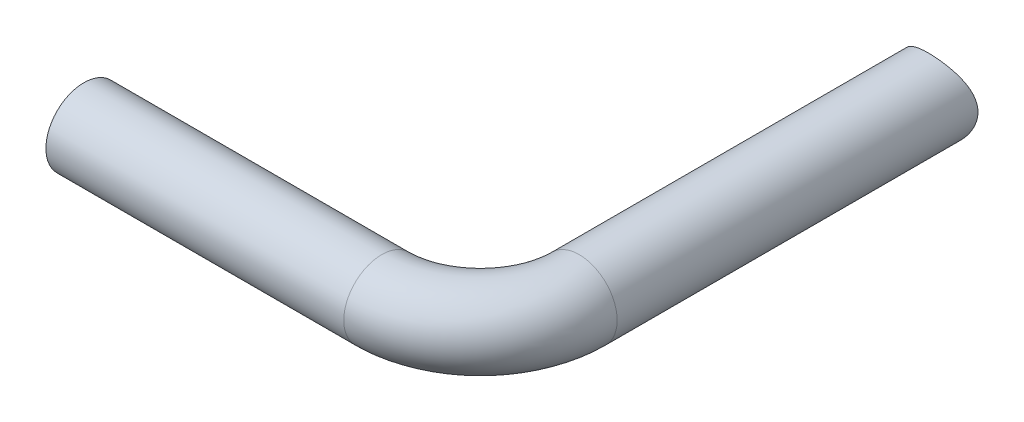
ISO-10303-21;
HEADER;
FILE_DESCRIPTION(('STEP AP214'),'2;1');
FILE_NAME('part.step','',(''),(''),'','','');
FILE_SCHEMA(('AUTOMOTIVE_DESIGN { 1 0 10303 214 1 1 1 1 }'));
ENDSEC;
DATA;
#1=APPLICATION_CONTEXT('core data for automotive mechanical design processes');
#2=APPLICATION_PROTOCOL_DEFINITION('international standard','automotive_design',2000,#1);
#3=PRODUCT_CONTEXT('',#1,'mechanical');
#4=PRODUCT('Part','Part','',(#3));
#5=PRODUCT_RELATED_PRODUCT_CATEGORY('part','',(#4));
#6=PRODUCT_DEFINITION_FORMATION('','',#4);
#7=PRODUCT_DEFINITION_CONTEXT('part definition',#1,'design');
#8=PRODUCT_DEFINITION('design','',#6,#7);
#9=PRODUCT_DEFINITION_SHAPE('','',#8);
#10=(LENGTH_UNIT() NAMED_UNIT(*) SI_UNIT(.MILLI.,.METRE.));
#11=(NAMED_UNIT(*) PLANE_ANGLE_UNIT() SI_UNIT($,.RADIAN.));
#12=(NAMED_UNIT(*) SI_UNIT($,.STERADIAN.) SOLID_ANGLE_UNIT());
#13=UNCERTAINTY_MEASURE_WITH_UNIT(LENGTH_MEASURE(1.E-05),#10,'distance_accuracy_value','');
#14=(GEOMETRIC_REPRESENTATION_CONTEXT(3) GLOBAL_UNCERTAINTY_ASSIGNED_CONTEXT((#13)) GLOBAL_UNIT_ASSIGNED_CONTEXT((#10,
#11,#12)) REPRESENTATION_CONTEXT('',''));
#15=CARTESIAN_POINT('',(0.,0.,0.));
#16=DIRECTION('',(0.,0.,1.));
#17=DIRECTION('',(1.,0.,0.));
#18=AXIS2_PLACEMENT_3D('',#15,#16,#17);
#19=CARTESIAN_POINT('',(41.26,0.61,-6.2));
#20=DIRECTION('',(-1.,0.,0.));
#21=DIRECTION('',(0.,0.,1.));
#22=AXIS2_PLACEMENT_3D('',#19,#20,#21);
#23=PLANE('',#22);
#24=CARTESIAN_POINT('',(41.26,0.61,-6.2));
#25=DIRECTION('',(1.,0.,0.));
#26=DIRECTION('',(0.,0.,-1.));
#27=AXIS2_PLACEMENT_3D('',#24,#25,#26);
#28=CIRCLE('',#27,0.51);
#29=CARTESIAN_POINT('',(41.26,0.61,-6.71));
#30=VERTEX_POINT('',#29);
#31=EDGE_CURVE('E17',#30,#30,#28,.T.);
#32=ORIENTED_EDGE('',*,*,#31,.F.);
#33=EDGE_LOOP('',(#32));
#34=FACE_BOUND('',#33,.T.);
#35=ADVANCED_FACE('F14',(#34),#23,.T.);
#36=CARTESIAN_POINT('',(43.26,0.61,-6.2));
#37=DIRECTION('',(1.,0.,0.));
#38=DIRECTION('',(0.,0.,-1.));
#39=AXIS2_PLACEMENT_3D('',#36,#37,#38);
#40=CYLINDRICAL_SURFACE('',#39,0.51);
#41=CARTESIAN_POINT('',(45.26,0.61,-6.2));
#42=DIRECTION('',(-1.,0.,0.));
#43=DIRECTION('',(0.,0.,1.));
#44=AXIS2_PLACEMENT_3D('',#41,#42,#43);
#45=CIRCLE('',#44,0.51);
#46=CARTESIAN_POINT('',(45.26,0.61,-5.69));
#47=VERTEX_POINT('',#46);
#48=EDGE_CURVE('E25',#47,#47,#45,.F.);
#49=ORIENTED_EDGE('',*,*,#48,.F.);
#50=EDGE_LOOP('',(#49));
#51=FACE_BOUND('',#50,.T.);
#52=ORIENTED_EDGE('',*,*,#31,.T.);
#53=EDGE_LOOP('',(#52));
#54=FACE_BOUND('',#53,.T.);
#55=ADVANCED_FACE('F50',(#51,#54),#40,.T.);
#56=CARTESIAN_POINT('',(45.26,0.61,-7.526));
#57=DIRECTION('',(0.,-1.,0.));
#58=DIRECTION('',(0.,0.,-1.));
#59=AXIS2_PLACEMENT_3D('',#56,#57,#58);
#60=TOROIDAL_SURFACE('',#59,1.326,0.51);
#61=CARTESIAN_POINT('',(46.586,0.61,-7.526));
#62=DIRECTION('',(0.,0.,1.));
#63=DIRECTION('',(1.,0.,0.));
#64=AXIS2_PLACEMENT_3D('',#61,#62,#63);
#65=CIRCLE('',#64,0.51);
#66=CARTESIAN_POINT('',(47.096,0.61,-7.526));
#67=VERTEX_POINT('',#66);
#68=EDGE_CURVE('E21',#67,#67,#65,.F.);
#69=ORIENTED_EDGE('',*,*,#68,.F.);
#70=EDGE_LOOP('',(#69));
#71=FACE_BOUND('',#70,.T.);
#72=ORIENTED_EDGE('',*,*,#48,.T.);
#73=EDGE_LOOP('',(#72));
#74=FACE_BOUND('',#73,.T.);
#75=ADVANCED_FACE('F44',(#71,#74),#60,.T.);
#76=CARTESIAN_POINT('',(46.586,2.59,-13.126));
#77=DIRECTION('',(0.,-1.,0.));
#78=DIRECTION('',(0.,0.,-1.));
#79=AXIS2_PLACEMENT_3D('',#76,#77,#78);
#80=CYLINDRICAL_SURFACE('',#79,0.91);
#81=CARTESIAN_POINT('',(46.076,0.61,-12.3723422527433));
#82=CARTESIAN_POINT('',(46.0760011185368,0.583947794696761,-12.3723406179026));
#83=CARTESIAN_POINT('',(46.0780089634663,0.557886797288869,-12.3709708472489));
#84=CARTESIAN_POINT('',(46.0859136943479,0.506613761133019,-12.3657139812751));
#85=CARTESIAN_POINT('',(46.0918151205027,0.481402749648731,-12.3618239472376));
#86=CARTESIAN_POINT('',(46.1071450050537,0.432666833870399,-12.3521274781385));
#87=CARTESIAN_POINT('',(46.1165513614189,0.409132441931249,-12.3463330784327));
#88=CARTESIAN_POINT('',(46.1385544914014,0.363983766202174,-12.3335011781712));
#89=CARTESIAN_POINT('',(46.1511522402025,0.342370072045698,-12.3264632978481));
#90=CARTESIAN_POINT('',(46.1807291615114,0.299177179368038,-12.311038815398));
#91=CARTESIAN_POINT('',(46.1980298961424,0.277840958078219,-12.3025882205314));
#92=CARTESIAN_POINT('',(46.2358584780449,0.238176635650665,-12.2858038842818));
#93=CARTESIAN_POINT('',(46.256388301828,0.219850391044218,-12.2774702178956));
#94=CARTESIAN_POINT('',(46.3023446591032,0.185097716328925,-12.2609639623549));
#95=CARTESIAN_POINT('',(46.3280457987454,0.168991553750139,-12.2528736418522));
#96=CARTESIAN_POINT('',(46.3823322838017,0.141445249650655,-12.2386419904024));
#97=CARTESIAN_POINT('',(46.4109153176242,0.13000140500843,-12.2324991135305));
#98=CARTESIAN_POINT('',(46.467561923015,0.113140671004892,-12.2233241228085));
#99=CARTESIAN_POINT('',(46.4954599860796,0.107291229259343,-12.2200704865402));
#100=CARTESIAN_POINT('',(46.5520139834379,0.100338645572216,-12.2161946012815));
#101=CARTESIAN_POINT('',(46.580669301052,0.0992317544553009,-12.2155702737245));
#102=CARTESIAN_POINT('',(46.6345773101403,0.101680895857451,-12.2169411038795));
#103=CARTESIAN_POINT('',(46.6598615362827,0.104743541129052,-12.2186591216186));
#104=CARTESIAN_POINT('',(46.7094875832137,0.114530060172952,-12.2240721517761));
#105=CARTESIAN_POINT('',(46.7338293359428,0.121254197828513,-12.2277673066862));
#106=CARTESIAN_POINT('',(46.7812118177706,0.138161168167377,-12.2368539317001));
#107=CARTESIAN_POINT('',(46.8042372879167,0.14837756999724,-12.2422618268652));
#108=CARTESIAN_POINT('',(46.8482887984998,0.171903206767577,-12.2543195105889));
#109=CARTESIAN_POINT('',(46.8693142289042,0.185213381104762,-12.2609696762313));
#110=CARTESIAN_POINT('',(46.9112525500908,0.216218389404745,-12.2757892777103));
#111=CARTESIAN_POINT('',(46.9318968476062,0.234235035148259,-12.2840453867013));
#112=CARTESIAN_POINT('',(46.9700346476845,0.273304429560716,-12.3007413644872));
#113=CARTESIAN_POINT('',(46.9875243117843,0.294360821586633,-12.3091814433274));
#114=CARTESIAN_POINT('',(47.0204943650623,0.341276788877642,-12.3261938421969));
#115=CARTESIAN_POINT('',(47.0356324840402,0.367401626174462,-12.3347043292896));
#116=CARTESIAN_POINT('',(47.0611898079464,0.422361526485351,-12.3497805279288));
#117=CARTESIAN_POINT('',(47.0716188142144,0.451190808023664,-12.3563502689049));
#118=CARTESIAN_POINT('',(47.0848634973058,0.501828445962841,-12.3648974540506));
#119=CARTESIAN_POINT('',(47.0890233934759,0.523157224778566,-12.3676607486803));
#120=CARTESIAN_POINT('',(47.0945913374499,0.566322137912423,-12.3713833244643));
#121=CARTESIAN_POINT('',(47.0960009377749,0.588157978948865,-12.3723436233846));
#122=CARTESIAN_POINT('',(47.0959988814632,0.63605220530324,-12.3723406179026));
#123=CARTESIAN_POINT('',(47.0939910365337,0.662113202711132,-12.3709708472489));
#124=CARTESIAN_POINT('',(47.0860863056521,0.713386238866981,-12.3657139812751));
#125=CARTESIAN_POINT('',(47.0801848794973,0.73859725035127,-12.3618239472376));
#126=CARTESIAN_POINT('',(47.0648549949463,0.787333166129602,-12.3521274781385));
#127=CARTESIAN_POINT('',(47.0554486385811,0.810867558068752,-12.3463330784327));
#128=CARTESIAN_POINT('',(47.0334455085986,0.856016233797827,-12.3335011781712));
#129=CARTESIAN_POINT('',(47.0208477597975,0.877629927954304,-12.3264632978481));
#130=CARTESIAN_POINT('',(46.9912708384886,0.920822820631964,-12.311038815398));
#131=CARTESIAN_POINT('',(46.9739701038577,0.942159041921781,-12.3025882205314));
#132=CARTESIAN_POINT('',(46.9361415219551,0.981823364349335,-12.2858038842818));
#133=CARTESIAN_POINT('',(46.915611698172,1.00014960895578,-12.2774702178956));
#134=CARTESIAN_POINT('',(46.8696553408968,1.03490228367108,-12.2609639623549));
#135=CARTESIAN_POINT('',(46.8439542012546,1.05100844624986,-12.2528736418522));
#136=CARTESIAN_POINT('',(46.7896677161983,1.07855475034935,-12.2386419904024));
#137=CARTESIAN_POINT('',(46.7610846823758,1.08999859499157,-12.2324991135305));
#138=CARTESIAN_POINT('',(46.704438076985,1.10685932899511,-12.2233241228085));
#139=CARTESIAN_POINT('',(46.6765400139204,1.11270877074066,-12.2200704865402));
#140=CARTESIAN_POINT('',(46.6199860165621,1.11966135442778,-12.2161946012815));
#141=CARTESIAN_POINT('',(46.591330698948,1.1207682455447,-12.2155702737245));
#142=CARTESIAN_POINT('',(46.5374226898597,1.11831910414255,-12.2169411038795));
#143=CARTESIAN_POINT('',(46.5121384637173,1.11525645887095,-12.2186591216186));
#144=CARTESIAN_POINT('',(46.4625124167863,1.10546993982705,-12.2240721517761));
#145=CARTESIAN_POINT('',(46.4381706640572,1.09874580217149,-12.2277673066862));
#146=CARTESIAN_POINT('',(46.3907881822294,1.08183883183262,-12.2368539317001));
#147=CARTESIAN_POINT('',(46.3677627120833,1.07162243000276,-12.2422618268652));
#148=CARTESIAN_POINT('',(46.3237112015002,1.04809679323242,-12.2543195105889));
#149=CARTESIAN_POINT('',(46.3026857710958,1.03478661889523,-12.2609696762313));
#150=CARTESIAN_POINT('',(46.2607474499092,1.00378161059525,-12.2757892777103));
#151=CARTESIAN_POINT('',(46.2401031523938,0.98576496485174,-12.2840453867013));
#152=CARTESIAN_POINT('',(46.2019653523155,0.946695570439283,-12.3007413644872));
#153=CARTESIAN_POINT('',(46.1844756882157,0.925639178413367,-12.3091814433274));
#154=CARTESIAN_POINT('',(46.1515056349377,0.878723211122357,-12.3261938421969));
#155=CARTESIAN_POINT('',(46.1363675159598,0.852598373825536,-12.3347043292896));
#156=CARTESIAN_POINT('',(46.1108101920536,0.797638473514647,-12.3497805279288));
#157=CARTESIAN_POINT('',(46.1003811857856,0.768809191976335,-12.3563502689049));
#158=CARTESIAN_POINT('',(46.0871365026942,0.718171554037159,-12.3648974540506));
#159=CARTESIAN_POINT('',(46.0829766065241,0.696842775221434,-12.3676607486803));
#160=CARTESIAN_POINT('',(46.0774086625501,0.653677862087578,-12.3713833244643));
#161=CARTESIAN_POINT('',(46.0759990622251,0.631842021051136,-12.3723436233846));
#162=CARTESIAN_POINT('',(46.076,0.61,-12.3723422527433));
#163=B_SPLINE_CURVE_WITH_KNOTS('',3,(#81,#82,#83,#84,#85,#86,#87,#88,#89,#90,#91,#92,#93,#94,
#95,#96,#97,#98,#99,#100,#101,#102,#103,#104,#105,#106,#107,#108,#109,#110,#111,#112,#113,#114,
#115,#116,#117,#118,#119,#120,#121,#122,#123,#124,#125,#126,#127,#128,#129,#130,#131,#132,#133,
#134,#135,#136,#137,#138,#139,#140,#141,#142,#143,#144,#145,#146,#147,#148,#149,#150,#151,#152,
#153,#154,#155,#156,#157,#158,#159,#160,#161,#162),.UNSPECIFIED.,.T.,.F.,(4,2,2,2,2,2,2,2,2,2,2,
2,2,2,2,2,2,2,2,2,2,2,2,2,2,2,2,2,2,2,2,2,2,2,2,2,2,2,2,2,4),(0.,0.0780652846652818,
0.156221760472621,0.23389350156941,0.311589005267886,0.397460596556616,0.483384955504667,
0.577056409990673,0.670653318674956,0.75622686516454,0.841732749857804,0.917951760269804,
0.994176264502731,1.07115509561728,1.14815733127937,1.23365911701388,1.31926424706791,
1.4128978186989,1.50633559693077,1.57182206581107,1.63727155736755,1.71533684203283,
1.79349331784017,1.87116505893696,1.94886056263543,2.03473215392416,2.12065651287221,
2.21432796735823,2.3079248760425,2.39349842253209,2.47900430722535,2.55522331763735,
2.63144782187028,2.70842665298484,2.78542888864692,2.87093067438143,2.95653580443545,
3.05016937606644,3.14360715429832,3.20909362317861,3.27454311473509),.UNSPECIFIED.);
#164=CARTESIAN_POINT('',(46.076,0.61,-12.3723422527433));
#165=VERTEX_POINT('',#164);
#166=EDGE_CURVE('E10',#165,#165,#163,.T.);
#167=ORIENTED_EDGE('',*,*,#166,.F.);
#168=EDGE_LOOP('',(#167));
#169=FACE_BOUND('',#168,.T.);
#170=ADVANCED_FACE('F33',(#169),#80,.F.);
#171=CARTESIAN_POINT('',(46.586,0.61,-9.526));
#172=DIRECTION('',(0.,0.,1.));
#173=DIRECTION('',(1.,0.,0.));
#174=AXIS2_PLACEMENT_3D('',#171,#172,#173);
#175=CYLINDRICAL_SURFACE('',#174,0.51);
#176=ORIENTED_EDGE('',*,*,#68,.T.);
#177=EDGE_LOOP('',(#176));
#178=FACE_BOUND('',#177,.T.);
#179=ORIENTED_EDGE('',*,*,#166,.T.);
#180=EDGE_LOOP('',(#179));
#181=FACE_BOUND('',#180,.T.);
#182=ADVANCED_FACE('F36',(#178,#181),#175,.T.);
#183=CLOSED_SHELL('',(#35,#55,#75,#170,#182));
#184=MANIFOLD_SOLID_BREP('B1',#183);
#185=ADVANCED_BREP_SHAPE_REPRESENTATION('',(#18,#184),#14);
#186=SHAPE_DEFINITION_REPRESENTATION(#9,#185);
ENDSEC;
END-ISO-10303-21;
